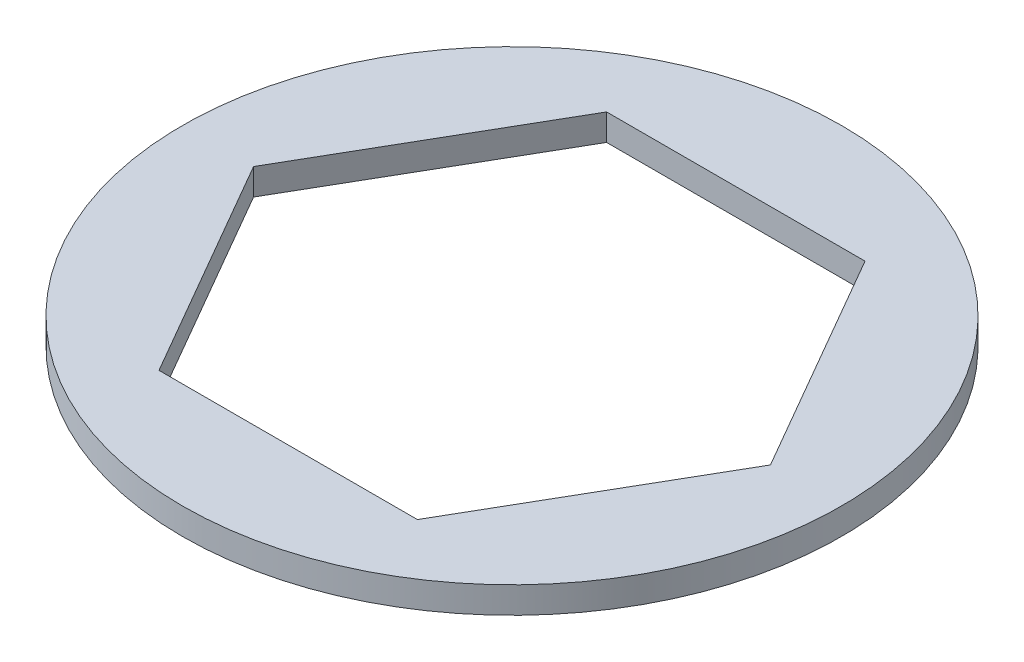
ISO-10303-21;
HEADER;
FILE_DESCRIPTION(('STEP AP214'),'2;1');
FILE_NAME('part.step','',(''),(''),'','','');
FILE_SCHEMA(('AUTOMOTIVE_DESIGN { 1 0 10303 214 1 1 1 1 }'));
ENDSEC;
DATA;
#1=APPLICATION_CONTEXT('core data for automotive mechanical design processes');
#2=APPLICATION_PROTOCOL_DEFINITION('international standard','automotive_design',2000,#1);
#3=PRODUCT_CONTEXT('',#1,'mechanical');
#4=PRODUCT('Part','Part','',(#3));
#5=PRODUCT_RELATED_PRODUCT_CATEGORY('part','',(#4));
#6=PRODUCT_DEFINITION_FORMATION('','',#4);
#7=PRODUCT_DEFINITION_CONTEXT('part definition',#1,'design');
#8=PRODUCT_DEFINITION('design','',#6,#7);
#9=PRODUCT_DEFINITION_SHAPE('','',#8);
#10=(LENGTH_UNIT() NAMED_UNIT(*) SI_UNIT(.MILLI.,.METRE.));
#11=(NAMED_UNIT(*) PLANE_ANGLE_UNIT() SI_UNIT($,.RADIAN.));
#12=(NAMED_UNIT(*) SI_UNIT($,.STERADIAN.) SOLID_ANGLE_UNIT());
#13=UNCERTAINTY_MEASURE_WITH_UNIT(LENGTH_MEASURE(1.E-05),#10,'distance_accuracy_value','');
#14=(GEOMETRIC_REPRESENTATION_CONTEXT(3) GLOBAL_UNCERTAINTY_ASSIGNED_CONTEXT((#13)) GLOBAL_UNIT_ASSIGNED_CONTEXT((#10,
#11,#12)) REPRESENTATION_CONTEXT('',''));
#15=CARTESIAN_POINT('',(0.,0.,0.));
#16=DIRECTION('',(0.,0.,1.));
#17=DIRECTION('',(1.,0.,0.));
#18=AXIS2_PLACEMENT_3D('',#15,#16,#17);
#19=CARTESIAN_POINT('',(0.,-0.762,0.));
#20=DIRECTION('',(0.,1.,0.));
#21=DIRECTION('',(0.,0.,1.));
#22=AXIS2_PLACEMENT_3D('',#19,#20,#21);
#23=CYLINDRICAL_SURFACE('',#22,9.5);
#24=CARTESIAN_POINT('',(0.,-0.762,0.));
#25=DIRECTION('',(0.,1.,0.));
#26=DIRECTION('',(0.,0.,1.));
#27=AXIS2_PLACEMENT_3D('',#24,#25,#26);
#28=CIRCLE('',#27,9.5);
#29=CARTESIAN_POINT('',(0.,-0.762,9.5));
#30=VERTEX_POINT('',#29);
#31=EDGE_CURVE('E11',#30,#30,#28,.T.);
#32=CARTESIAN_POINT('',(0.,0.,0.));
#33=DIRECTION('',(0.,1.,0.));
#34=DIRECTION('',(0.,0.,1.));
#35=AXIS2_PLACEMENT_3D('',#32,#33,#34);
#36=CIRCLE('',#35,9.5);
#37=CARTESIAN_POINT('',(0.,0.,9.5));
#38=VERTEX_POINT('',#37);
#39=EDGE_CURVE('E42',#38,#38,#36,.T.);
#40=CARTESIAN_POINT('',(0.,-0.762,9.5));
#41=CARTESIAN_POINT('',(0.,-0.7540625,9.5));
#42=CARTESIAN_POINT('',(0.,-0.746125,9.5));
#43=CARTESIAN_POINT('',(0.,-0.73025,9.5));
#44=CARTESIAN_POINT('',(0.,-0.7223125,9.5));
#45=CARTESIAN_POINT('',(0.,-0.7064375,9.5));
#46=CARTESIAN_POINT('',(0.,-0.6985,9.5));
#47=CARTESIAN_POINT('',(0.,-0.682625,9.5));
#48=CARTESIAN_POINT('',(0.,-0.6746875,9.5));
#49=CARTESIAN_POINT('',(0.,-0.6588125,9.5));
#50=CARTESIAN_POINT('',(0.,-0.650875,9.5));
#51=CARTESIAN_POINT('',(0.,-0.635,9.5));
#52=CARTESIAN_POINT('',(0.,-0.6270625,9.5));
#53=CARTESIAN_POINT('',(0.,-0.6111875,9.5));
#54=CARTESIAN_POINT('',(0.,-0.60325,9.5));
#55=CARTESIAN_POINT('',(0.,-0.587375,9.5));
#56=CARTESIAN_POINT('',(0.,-0.5794375,9.5));
#57=CARTESIAN_POINT('',(0.,-0.5635625,9.5));
#58=CARTESIAN_POINT('',(0.,-0.555625,9.5));
#59=CARTESIAN_POINT('',(0.,-0.53975,9.5));
#60=CARTESIAN_POINT('',(0.,-0.5318125,9.5));
#61=CARTESIAN_POINT('',(0.,-0.5159375,9.5));
#62=CARTESIAN_POINT('',(0.,-0.508,9.5));
#63=CARTESIAN_POINT('',(0.,-0.492125,9.5));
#64=CARTESIAN_POINT('',(0.,-0.4841875,9.5));
#65=CARTESIAN_POINT('',(0.,-0.4683125,9.5));
#66=CARTESIAN_POINT('',(0.,-0.460375,9.5));
#67=CARTESIAN_POINT('',(0.,-0.4445,9.5));
#68=CARTESIAN_POINT('',(0.,-0.4365625,9.5));
#69=CARTESIAN_POINT('',(0.,-0.4206875,9.5));
#70=CARTESIAN_POINT('',(0.,-0.41275,9.5));
#71=CARTESIAN_POINT('',(0.,-0.396875,9.5));
#72=CARTESIAN_POINT('',(0.,-0.3889375,9.5));
#73=CARTESIAN_POINT('',(0.,-0.3730625,9.5));
#74=CARTESIAN_POINT('',(0.,-0.365125,9.5));
#75=CARTESIAN_POINT('',(0.,-0.34925,9.5));
#76=CARTESIAN_POINT('',(0.,-0.3413125,9.5));
#77=CARTESIAN_POINT('',(0.,-0.3254375,9.5));
#78=CARTESIAN_POINT('',(0.,-0.3175,9.5));
#79=CARTESIAN_POINT('',(0.,-0.301625,9.5));
#80=CARTESIAN_POINT('',(0.,-0.2936875,9.5));
#81=CARTESIAN_POINT('',(0.,-0.2778125,9.5));
#82=CARTESIAN_POINT('',(0.,-0.269875,9.5));
#83=CARTESIAN_POINT('',(0.,-0.254,9.5));
#84=CARTESIAN_POINT('',(0.,-0.2460625,9.5));
#85=CARTESIAN_POINT('',(0.,-0.2301875,9.5));
#86=CARTESIAN_POINT('',(0.,-0.22225,9.5));
#87=CARTESIAN_POINT('',(0.,-0.206375,9.5));
#88=CARTESIAN_POINT('',(0.,-0.1984375,9.5));
#89=CARTESIAN_POINT('',(0.,-0.1825625,9.5));
#90=CARTESIAN_POINT('',(0.,-0.174625,9.5));
#91=CARTESIAN_POINT('',(0.,-0.15875,9.5));
#92=CARTESIAN_POINT('',(0.,-0.1508125,9.5));
#93=CARTESIAN_POINT('',(0.,-0.1349375,9.5));
#94=CARTESIAN_POINT('',(0.,-0.127,9.5));
#95=CARTESIAN_POINT('',(0.,-0.111125,9.5));
#96=CARTESIAN_POINT('',(0.,-0.1031875,9.5));
#97=CARTESIAN_POINT('',(0.,-0.0873125,9.5));
#98=CARTESIAN_POINT('',(0.,-0.079375,9.5));
#99=CARTESIAN_POINT('',(0.,-0.0635,9.5));
#100=CARTESIAN_POINT('',(0.,-0.0555625,9.5));
#101=CARTESIAN_POINT('',(0.,-0.0396875,9.5));
#102=CARTESIAN_POINT('',(0.,-0.03175,9.5));
#103=CARTESIAN_POINT('',(0.,-0.015875,9.5));
#104=CARTESIAN_POINT('',(0.,-0.00793749999999999,9.5));
#105=CARTESIAN_POINT('',(0.,0.,9.5));
#106=B_SPLINE_CURVE_WITH_KNOTS('',3,(#40,#41,#42,#43,#44,#45,#46,#47,#48,#49,#50,#51,#52,#53,
#54,#55,#56,#57,#58,#59,#60,#61,#62,#63,#64,#65,#66,#67,#68,#69,#70,#71,#72,#73,#74,#75,#76,#77,
#78,#79,#80,#81,#82,#83,#84,#85,#86,#87,#88,#89,#90,#91,#92,#93,#94,#95,#96,#97,#98,#99,#100,
#101,#102,#103,#104,#105),.UNSPECIFIED.,.F.,.F.,(4,2,2,2,2,2,2,2,2,2,2,2,2,2,2,2,2,2,2,2,2,2,2,
2,2,2,2,2,2,2,2,2,4),(0.,0.0238125,0.0476249999999999,0.0714375,0.09525,0.1190625,0.142875,
0.1666875,0.1905,0.2143125,0.238125,0.2619375,0.28575,0.3095625,0.333375,0.3571875,0.381,
0.4048125,0.428625,0.4524375,0.47625,0.5000625,0.523875,0.5476875,0.5715,0.5953125,0.619125,
0.6429375,0.66675,0.6905625,0.714375,0.7381875,0.762),.UNSPECIFIED.);
#107=EDGE_CURVE('BSEAM39',#30,#38,#106,.T.);
#108=ORIENTED_EDGE('',*,*,#31,.T.);
#109=ORIENTED_EDGE('',*,*,#39,.F.);
#110=ORIENTED_EDGE('',*,*,#107,.T.);
#111=ORIENTED_EDGE('',*,*,#107,.F.);
#112=EDGE_LOOP('',(#108,#110,#109,#111));
#113=FACE_BOUND('',#112,.T.);
#114=ADVANCED_FACE('F39',(#113),#23,.T.);
#115=CARTESIAN_POINT('',(0.,-0.762,0.));
#116=DIRECTION('',(0.,1.,0.));
#117=DIRECTION('',(0.,0.,1.));
#118=AXIS2_PLACEMENT_3D('',#115,#116,#117);
#119=PLANE('',#118);
#120=DIRECTION('',(1.,0.,0.));
#121=VECTOR('',#120,1.);
#122=CARTESIAN_POINT('',(-3.72483299670379,-0.762,6.4516));
#123=LINE('',#122,#121);
#124=CARTESIAN_POINT('',(-3.72483299670379,-0.762,6.4516));
#125=VERTEX_POINT('',#124);
#126=CARTESIAN_POINT('',(3.72483299670379,-0.762,6.4516));
#127=VERTEX_POINT('',#126);
#128=EDGE_CURVE('E99',#125,#127,#123,.T.);
#129=ORIENTED_EDGE('',*,*,#128,.T.);
#130=DIRECTION('',(0.5,0.,-0.866025403784439));
#131=VECTOR('',#130,1.);
#132=CARTESIAN_POINT('',(3.72483299670379,-0.762,6.4516));
#133=LINE('',#132,#131);
#134=CARTESIAN_POINT('',(7.44966599340758,-0.762,0.));
#135=VERTEX_POINT('',#134);
#136=EDGE_CURVE('E93',#127,#135,#133,.T.);
#137=ORIENTED_EDGE('',*,*,#136,.T.);
#138=DIRECTION('',(-0.5,0.,-0.866025403784439));
#139=VECTOR('',#138,1.);
#140=CARTESIAN_POINT('',(7.44966599340758,-0.762,0.));
#141=LINE('',#140,#139);
#142=CARTESIAN_POINT('',(3.72483299670379,-0.762,-6.4516));
#143=VERTEX_POINT('',#142);
#144=EDGE_CURVE('E102',#135,#143,#141,.T.);
#145=ORIENTED_EDGE('',*,*,#144,.T.);
#146=DIRECTION('',(-1.,0.,0.));
#147=VECTOR('',#146,1.);
#148=CARTESIAN_POINT('',(3.72483299670379,-0.762,-6.4516));
#149=LINE('',#148,#147);
#150=CARTESIAN_POINT('',(-3.72483299670379,-0.762,-6.4516));
#151=VERTEX_POINT('',#150);
#152=EDGE_CURVE('E53',#143,#151,#149,.T.);
#153=ORIENTED_EDGE('',*,*,#152,.T.);
#154=DIRECTION('',(-0.5,0.,0.866025403784439));
#155=VECTOR('',#154,1.);
#156=CARTESIAN_POINT('',(-3.72483299670379,-0.762,-6.4516));
#157=LINE('',#156,#155);
#158=CARTESIAN_POINT('',(-7.44966599340758,-0.762,0.));
#159=VERTEX_POINT('',#158);
#160=EDGE_CURVE('E117',#151,#159,#157,.T.);
#161=ORIENTED_EDGE('',*,*,#160,.T.);
#162=DIRECTION('',(0.5,0.,0.866025403784438));
#163=VECTOR('',#162,1.);
#164=CARTESIAN_POINT('',(-7.44966599340758,-0.762,0.));
#165=LINE('',#164,#163);
#166=EDGE_CURVE('E120',#159,#125,#165,.T.);
#167=ORIENTED_EDGE('',*,*,#166,.T.);
#168=EDGE_LOOP('',(#129,#137,#145,#153,#161,#167));
#169=FACE_BOUND('',#168,.T.);
#170=ORIENTED_EDGE('',*,*,#31,.F.);
#171=EDGE_LOOP('',(#170));
#172=FACE_BOUND('',#171,.T.);
#173=ADVANCED_FACE('F106',(#169,#172),#119,.F.);
#174=CARTESIAN_POINT('',(0.,0.,0.));
#175=DIRECTION('',(0.,1.,0.));
#176=DIRECTION('',(0.,0.,1.));
#177=AXIS2_PLACEMENT_3D('',#174,#175,#176);
#178=PLANE('',#177);
#179=DIRECTION('',(0.5,0.,-0.866025403784439));
#180=VECTOR('',#179,1.);
#181=CARTESIAN_POINT('',(3.72483299670379,0.,6.4516));
#182=LINE('',#181,#180);
#183=CARTESIAN_POINT('',(3.72483299670379,0.,6.4516));
#184=VERTEX_POINT('',#183);
#185=CARTESIAN_POINT('',(7.44966599340758,0.,0.));
#186=VERTEX_POINT('',#185);
#187=EDGE_CURVE('E61',#184,#186,#182,.T.);
#188=ORIENTED_EDGE('',*,*,#187,.F.);
#189=DIRECTION('',(1.,0.,0.));
#190=VECTOR('',#189,1.);
#191=CARTESIAN_POINT('',(-3.72483299670379,0.,6.4516));
#192=LINE('',#191,#190);
#193=CARTESIAN_POINT('',(-3.72483299670379,0.,6.4516));
#194=VERTEX_POINT('',#193);
#195=EDGE_CURVE('E110',#194,#184,#192,.T.);
#196=ORIENTED_EDGE('',*,*,#195,.F.);
#197=DIRECTION('',(0.5,0.,0.866025403784438));
#198=VECTOR('',#197,1.);
#199=CARTESIAN_POINT('',(-7.44966599340758,0.,0.));
#200=LINE('',#199,#198);
#201=CARTESIAN_POINT('',(-7.44966599340758,0.,0.));
#202=VERTEX_POINT('',#201);
#203=EDGE_CURVE('E113',#202,#194,#200,.T.);
#204=ORIENTED_EDGE('',*,*,#203,.F.);
#205=DIRECTION('',(-0.5,0.,0.866025403784439));
#206=VECTOR('',#205,1.);
#207=CARTESIAN_POINT('',(-3.72483299670379,0.,-6.4516));
#208=LINE('',#207,#206);
#209=CARTESIAN_POINT('',(-3.72483299670379,0.,-6.4516));
#210=VERTEX_POINT('',#209);
#211=EDGE_CURVE('E129',#210,#202,#208,.T.);
#212=ORIENTED_EDGE('',*,*,#211,.F.);
#213=DIRECTION('',(-1.,0.,0.));
#214=VECTOR('',#213,1.);
#215=CARTESIAN_POINT('',(3.72483299670379,0.,-6.4516));
#216=LINE('',#215,#214);
#217=CARTESIAN_POINT('',(3.72483299670379,0.,-6.4516));
#218=VERTEX_POINT('',#217);
#219=EDGE_CURVE('E126',#218,#210,#216,.T.);
#220=ORIENTED_EDGE('',*,*,#219,.F.);
#221=DIRECTION('',(-0.5,0.,-0.866025403784439));
#222=VECTOR('',#221,1.);
#223=CARTESIAN_POINT('',(7.44966599340758,0.,0.));
#224=LINE('',#223,#222);
#225=EDGE_CURVE('E124',#186,#218,#224,.T.);
#226=ORIENTED_EDGE('',*,*,#225,.F.);
#227=EDGE_LOOP('',(#188,#196,#204,#212,#220,#226));
#228=FACE_BOUND('',#227,.T.);
#229=ORIENTED_EDGE('',*,*,#39,.T.);
#230=EDGE_LOOP('',(#229));
#231=FACE_BOUND('',#230,.T.);
#232=ADVANCED_FACE('F146',(#228,#231),#178,.T.);
#233=CARTESIAN_POINT('',(3.72483299670379,-0.762,6.4516));
#234=DIRECTION('',(0.866025403784439,0.,0.5));
#235=DIRECTION('',(0.5,0.,-0.866025403784439));
#236=AXIS2_PLACEMENT_3D('',#233,#234,#235);
#237=PLANE('',#236);
#238=ORIENTED_EDGE('',*,*,#187,.T.);
#239=DIRECTION('',(0.,1.,0.));
#240=VECTOR('',#239,1.);
#241=CARTESIAN_POINT('',(7.44966599340758,-0.762,0.));
#242=LINE('',#241,#240);
#243=EDGE_CURVE('E89',#135,#186,#242,.T.);
#244=ORIENTED_EDGE('',*,*,#243,.F.);
#245=ORIENTED_EDGE('',*,*,#136,.F.);
#246=DIRECTION('',(0.,1.,0.));
#247=VECTOR('',#246,1.);
#248=CARTESIAN_POINT('',(3.72483299670379,-0.762,6.4516));
#249=LINE('',#248,#247);
#250=EDGE_CURVE('E134',#127,#184,#249,.T.);
#251=ORIENTED_EDGE('',*,*,#250,.T.);
#252=EDGE_LOOP('',(#238,#244,#245,#251));
#253=FACE_BOUND('',#252,.T.);
#254=ADVANCED_FACE('F91',(#253),#237,.F.);
#255=CARTESIAN_POINT('',(-3.72483299670379,-0.762,6.4516));
#256=DIRECTION('',(0.,0.,1.));
#257=DIRECTION('',(1.,0.,0.));
#258=AXIS2_PLACEMENT_3D('',#255,#256,#257);
#259=PLANE('',#258);
#260=ORIENTED_EDGE('',*,*,#195,.T.);
#261=ORIENTED_EDGE('',*,*,#250,.F.);
#262=ORIENTED_EDGE('',*,*,#128,.F.);
#263=DIRECTION('',(0.,1.,0.));
#264=VECTOR('',#263,1.);
#265=CARTESIAN_POINT('',(-3.72483299670379,-0.762,6.4516));
#266=LINE('',#265,#264);
#267=EDGE_CURVE('E136',#125,#194,#266,.T.);
#268=ORIENTED_EDGE('',*,*,#267,.T.);
#269=EDGE_LOOP('',(#260,#261,#262,#268));
#270=FACE_BOUND('',#269,.T.);
#271=ADVANCED_FACE('F157',(#270),#259,.F.);
#272=CARTESIAN_POINT('',(-7.44966599340758,-0.762,0.));
#273=DIRECTION('',(-0.866025403784438,0.,0.5));
#274=DIRECTION('',(0.5,0.,0.866025403784439));
#275=AXIS2_PLACEMENT_3D('',#272,#273,#274);
#276=PLANE('',#275);
#277=ORIENTED_EDGE('',*,*,#203,.T.);
#278=ORIENTED_EDGE('',*,*,#267,.F.);
#279=ORIENTED_EDGE('',*,*,#166,.F.);
#280=DIRECTION('',(0.,1.,0.));
#281=VECTOR('',#280,1.);
#282=CARTESIAN_POINT('',(-7.44966599340758,-0.762,0.));
#283=LINE('',#282,#281);
#284=EDGE_CURVE('E138',#159,#202,#283,.T.);
#285=ORIENTED_EDGE('',*,*,#284,.T.);
#286=EDGE_LOOP('',(#277,#278,#279,#285));
#287=FACE_BOUND('',#286,.T.);
#288=ADVANCED_FACE('F155',(#287),#276,.F.);
#289=CARTESIAN_POINT('',(-3.72483299670379,-0.762,-6.4516));
#290=DIRECTION('',(-0.866025403784439,0.,-0.5));
#291=DIRECTION('',(-0.5,0.,0.866025403784439));
#292=AXIS2_PLACEMENT_3D('',#289,#290,#291);
#293=PLANE('',#292);
#294=ORIENTED_EDGE('',*,*,#211,.T.);
#295=ORIENTED_EDGE('',*,*,#284,.F.);
#296=ORIENTED_EDGE('',*,*,#160,.F.);
#297=DIRECTION('',(0.,1.,0.));
#298=VECTOR('',#297,1.);
#299=CARTESIAN_POINT('',(-3.72483299670379,-0.762,-6.4516));
#300=LINE('',#299,#298);
#301=EDGE_CURVE('E140',#151,#210,#300,.T.);
#302=ORIENTED_EDGE('',*,*,#301,.T.);
#303=EDGE_LOOP('',(#294,#295,#296,#302));
#304=FACE_BOUND('',#303,.T.);
#305=ADVANCED_FACE('F151',(#304),#293,.F.);
#306=CARTESIAN_POINT('',(3.72483299670379,-0.762,-6.4516));
#307=DIRECTION('',(0.,0.,-1.));
#308=DIRECTION('',(-1.,0.,0.));
#309=AXIS2_PLACEMENT_3D('',#306,#307,#308);
#310=PLANE('',#309);
#311=ORIENTED_EDGE('',*,*,#219,.T.);
#312=ORIENTED_EDGE('',*,*,#301,.F.);
#313=ORIENTED_EDGE('',*,*,#152,.F.);
#314=DIRECTION('',(0.,1.,0.));
#315=VECTOR('',#314,1.);
#316=CARTESIAN_POINT('',(3.72483299670379,-0.762,-6.4516));
#317=LINE('',#316,#315);
#318=EDGE_CURVE('E98',#143,#218,#317,.T.);
#319=ORIENTED_EDGE('',*,*,#318,.T.);
#320=EDGE_LOOP('',(#311,#312,#313,#319));
#321=FACE_BOUND('',#320,.T.);
#322=ADVANCED_FACE('F142',(#321),#310,.F.);
#323=CARTESIAN_POINT('',(7.44966599340758,-0.762,0.));
#324=DIRECTION('',(0.866025403784439,0.,-0.5));
#325=DIRECTION('',(-0.5,0.,-0.866025403784439));
#326=AXIS2_PLACEMENT_3D('',#323,#324,#325);
#327=PLANE('',#326);
#328=ORIENTED_EDGE('',*,*,#225,.T.);
#329=ORIENTED_EDGE('',*,*,#318,.F.);
#330=ORIENTED_EDGE('',*,*,#144,.F.);
#331=ORIENTED_EDGE('',*,*,#243,.T.);
#332=EDGE_LOOP('',(#328,#329,#330,#331));
#333=FACE_BOUND('',#332,.T.);
#334=ADVANCED_FACE('F103',(#333),#327,.F.);
#335=CLOSED_SHELL('',(#114,#173,#232,#254,#271,#288,#305,#322,#334));
#336=MANIFOLD_SOLID_BREP('B2',#335);
#337=ADVANCED_BREP_SHAPE_REPRESENTATION('',(#18,#336),#14);
#338=SHAPE_DEFINITION_REPRESENTATION(#9,#337);
ENDSEC;
END-ISO-10303-21;
